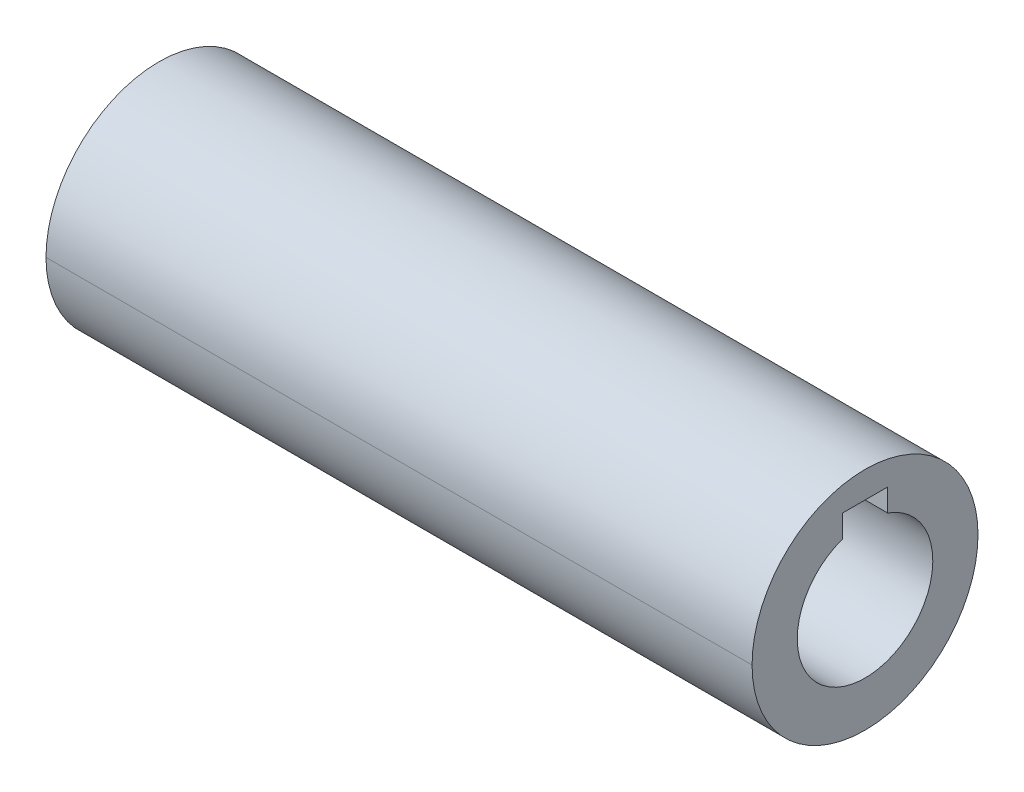
ISO-10303-21;
HEADER;
FILE_DESCRIPTION(('STEP AP214'),'2;1');
FILE_NAME('part.step','',(''),(''),'','','');
FILE_SCHEMA(('AUTOMOTIVE_DESIGN { 1 0 10303 214 1 1 1 1 }'));
ENDSEC;
DATA;
#1=APPLICATION_CONTEXT('core data for automotive mechanical design processes');
#2=APPLICATION_PROTOCOL_DEFINITION('international standard','automotive_design',2000,#1);
#3=PRODUCT_CONTEXT('',#1,'mechanical');
#4=PRODUCT('Part','Part','',(#3));
#5=PRODUCT_RELATED_PRODUCT_CATEGORY('part','',(#4));
#6=PRODUCT_DEFINITION_FORMATION('','',#4);
#7=PRODUCT_DEFINITION_CONTEXT('part definition',#1,'design');
#8=PRODUCT_DEFINITION('design','',#6,#7);
#9=PRODUCT_DEFINITION_SHAPE('','',#8);
#10=(LENGTH_UNIT() NAMED_UNIT(*) SI_UNIT(.MILLI.,.METRE.));
#11=(NAMED_UNIT(*) PLANE_ANGLE_UNIT() SI_UNIT($,.RADIAN.));
#12=(NAMED_UNIT(*) SI_UNIT($,.STERADIAN.) SOLID_ANGLE_UNIT());
#13=UNCERTAINTY_MEASURE_WITH_UNIT(LENGTH_MEASURE(1.E-05),#10,'distance_accuracy_value','');
#14=(GEOMETRIC_REPRESENTATION_CONTEXT(3) GLOBAL_UNCERTAINTY_ASSIGNED_CONTEXT((#13)) GLOBAL_UNIT_ASSIGNED_CONTEXT((#10,
#11,#12)) REPRESENTATION_CONTEXT('',''));
#15=CARTESIAN_POINT('',(0.,0.,0.));
#16=DIRECTION('',(0.,0.,1.));
#17=DIRECTION('',(1.,0.,0.));
#18=AXIS2_PLACEMENT_3D('',#15,#16,#17);
#19=CARTESIAN_POINT('',(125.,0.,0.));
#20=DIRECTION('',(-1.,0.,0.));
#21=DIRECTION('',(0.,-1.,0.));
#22=AXIS2_PLACEMENT_3D('',#19,#20,#21);
#23=CYLINDRICAL_SURFACE('',#22,20.);
#24=CARTESIAN_POINT('',(125.,0.,0.));
#25=DIRECTION('',(1.,0.,0.));
#26=DIRECTION('',(0.,0.,-1.));
#27=AXIS2_PLACEMENT_3D('',#24,#25,#26);
#28=CIRCLE('',#27,20.);
#29=CARTESIAN_POINT('',(125.,0.,-20.));
#30=VERTEX_POINT('',#29);
#31=CARTESIAN_POINT('',(125.,0.,20.));
#32=VERTEX_POINT('',#31);
#33=EDGE_CURVE('E11',#30,#32,#28,.T.);
#34=ORIENTED_EDGE('',*,*,#33,.F.);
#35=DIRECTION('',(-1.,0.,0.));
#36=VECTOR('',#35,1.);
#37=CARTESIAN_POINT('',(125.,0.,-20.));
#38=LINE('',#37,#36);
#39=CARTESIAN_POINT('',(0.,0.,-20.));
#40=VERTEX_POINT('',#39);
#41=EDGE_CURVE('E25',#30,#40,#38,.T.);
#42=ORIENTED_EDGE('',*,*,#41,.T.);
#43=CARTESIAN_POINT('',(0.,0.,0.));
#44=DIRECTION('',(1.,0.,0.));
#45=DIRECTION('',(0.,0.,-1.));
#46=AXIS2_PLACEMENT_3D('',#43,#44,#45);
#47=CIRCLE('',#46,20.);
#48=CARTESIAN_POINT('',(0.,0.,20.));
#49=VERTEX_POINT('',#48);
#50=EDGE_CURVE('E187',#40,#49,#47,.T.);
#51=ORIENTED_EDGE('',*,*,#50,.T.);
#52=DIRECTION('',(-1.,0.,0.));
#53=VECTOR('',#52,1.);
#54=CARTESIAN_POINT('',(125.,0.,20.));
#55=LINE('',#54,#53);
#56=EDGE_CURVE('E182',#32,#49,#55,.T.);
#57=ORIENTED_EDGE('',*,*,#56,.F.);
#58=EDGE_LOOP('',(#34,#42,#51,#57));
#59=FACE_BOUND('',#58,.T.);
#60=ADVANCED_FACE('F17',(#59),#23,.T.);
#61=CARTESIAN_POINT('',(125.,0.,0.));
#62=DIRECTION('',(-1.,0.,0.));
#63=DIRECTION('',(0.,1.,0.));
#64=AXIS2_PLACEMENT_3D('',#61,#62,#63);
#65=CYLINDRICAL_SURFACE('',#64,20.);
#66=CARTESIAN_POINT('',(0.,0.,0.));
#67=DIRECTION('',(1.,0.,0.));
#68=DIRECTION('',(0.,0.,-1.));
#69=AXIS2_PLACEMENT_3D('',#66,#67,#68);
#70=CIRCLE('',#69,20.);
#71=EDGE_CURVE('E178',#49,#40,#70,.T.);
#72=ORIENTED_EDGE('',*,*,#71,.T.);
#73=ORIENTED_EDGE('',*,*,#41,.F.);
#74=CARTESIAN_POINT('',(125.,0.,0.));
#75=DIRECTION('',(1.,0.,0.));
#76=DIRECTION('',(0.,0.,-1.));
#77=AXIS2_PLACEMENT_3D('',#74,#75,#76);
#78=CIRCLE('',#77,20.);
#79=EDGE_CURVE('E173',#32,#30,#78,.T.);
#80=ORIENTED_EDGE('',*,*,#79,.F.);
#81=ORIENTED_EDGE('',*,*,#56,.T.);
#82=EDGE_LOOP('',(#72,#73,#80,#81));
#83=FACE_BOUND('',#82,.T.);
#84=ADVANCED_FACE('F200',(#83),#65,.T.);
#85=CARTESIAN_POINT('',(125.,20.,0.));
#86=DIRECTION('',(-1.,0.,0.));
#87=DIRECTION('',(0.,0.,1.));
#88=AXIS2_PLACEMENT_3D('',#85,#86,#87);
#89=PLANE('',#88);
#90=DIRECTION('',(0.,0.,1.));
#91=VECTOR('',#90,1.);
#92=CARTESIAN_POINT('',(125.,15.3,-4.));
#93=LINE('',#92,#91);
#94=CARTESIAN_POINT('',(125.,15.3,-4.));
#95=VERTEX_POINT('',#94);
#96=CARTESIAN_POINT('',(125.,15.3,4.));
#97=VERTEX_POINT('',#96);
#98=EDGE_CURVE('E168',#95,#97,#93,.T.);
#99=ORIENTED_EDGE('',*,*,#98,.F.);
#100=DIRECTION('',(0.,1.,0.));
#101=VECTOR('',#100,1.);
#102=CARTESIAN_POINT('',(125.,3.3,-4.));
#103=LINE('',#102,#101);
#104=CARTESIAN_POINT('',(125.,11.3137084989848,-4.));
#105=VERTEX_POINT('',#104);
#106=EDGE_CURVE('E164',#105,#95,#103,.T.);
#107=ORIENTED_EDGE('',*,*,#106,.F.);
#108=CARTESIAN_POINT('',(125.,0.,0.));
#109=DIRECTION('',(1.,0.,0.));
#110=DIRECTION('',(0.,0.,-1.));
#111=AXIS2_PLACEMENT_3D('',#108,#109,#110);
#112=CIRCLE('',#111,12.);
#113=CARTESIAN_POINT('',(125.,11.3137084989848,4.));
#114=VERTEX_POINT('',#113);
#115=EDGE_CURVE('E159',#114,#105,#112,.T.);
#116=ORIENTED_EDGE('',*,*,#115,.F.);
#117=DIRECTION('',(0.,-1.,0.));
#118=VECTOR('',#117,1.);
#119=CARTESIAN_POINT('',(125.,15.3,4.));
#120=LINE('',#119,#118);
#121=EDGE_CURVE('E154',#97,#114,#120,.T.);
#122=ORIENTED_EDGE('',*,*,#121,.F.);
#123=EDGE_LOOP('',(#99,#107,#116,#122));
#124=FACE_BOUND('',#123,.T.);
#125=ORIENTED_EDGE('',*,*,#33,.T.);
#126=ORIENTED_EDGE('',*,*,#79,.T.);
#127=EDGE_LOOP('',(#125,#126));
#128=FACE_BOUND('',#127,.T.);
#129=ADVANCED_FACE('F215',(#124,#128),#89,.F.);
#130=CARTESIAN_POINT('',(75.,15.3,4.));
#131=DIRECTION('',(0.,0.,1.));
#132=DIRECTION('',(1.,0.,0.));
#133=AXIS2_PLACEMENT_3D('',#130,#131,#132);
#134=PLANE('',#133);
#135=DIRECTION('',(0.,-1.,0.));
#136=VECTOR('',#135,1.);
#137=CARTESIAN_POINT('',(105.,12.,4.));
#138=LINE('',#137,#136);
#139=CARTESIAN_POINT('',(105.,11.842719282327,4.));
#140=VERTEX_POINT('',#139);
#141=CARTESIAN_POINT('',(105.,11.3137084989848,4.));
#142=VERTEX_POINT('',#141);
#143=EDGE_CURVE('E149',#140,#142,#138,.T.);
#144=ORIENTED_EDGE('',*,*,#143,.F.);
#145=DIRECTION('',(1.,0.,0.));
#146=VECTOR('',#145,1.);
#147=CARTESIAN_POINT('',(125.,11.842719282327,4.));
#148=LINE('',#147,#146);
#149=CARTESIAN_POINT('',(75.,11.842719282327,4.));
#150=VERTEX_POINT('',#149);
#151=EDGE_CURVE('E145',#150,#140,#148,.T.);
#152=ORIENTED_EDGE('',*,*,#151,.F.);
#153=DIRECTION('',(0.,-1.,0.));
#154=VECTOR('',#153,1.);
#155=CARTESIAN_POINT('',(75.,15.3,4.));
#156=LINE('',#155,#154);
#157=CARTESIAN_POINT('',(75.,15.3,4.));
#158=VERTEX_POINT('',#157);
#159=EDGE_CURVE('E101',#158,#150,#156,.T.);
#160=ORIENTED_EDGE('',*,*,#159,.F.);
#161=DIRECTION('',(1.,0.,0.));
#162=VECTOR('',#161,1.);
#163=CARTESIAN_POINT('',(75.,15.3,4.));
#164=LINE('',#163,#162);
#165=EDGE_CURVE('E137',#158,#97,#164,.T.);
#166=ORIENTED_EDGE('',*,*,#165,.T.);
#167=ORIENTED_EDGE('',*,*,#121,.T.);
#168=DIRECTION('',(1.,0.,0.));
#169=VECTOR('',#168,1.);
#170=CARTESIAN_POINT('',(125.,11.3137084989848,4.));
#171=LINE('',#170,#169);
#172=EDGE_CURVE('E132',#142,#114,#171,.T.);
#173=ORIENTED_EDGE('',*,*,#172,.F.);
#174=EDGE_LOOP('',(#144,#152,#160,#166,#167,#173));
#175=FACE_BOUND('',#174,.T.);
#176=ADVANCED_FACE('F219',(#175),#134,.F.);
#177=CARTESIAN_POINT('',(125.,0.,0.));
#178=DIRECTION('',(-1.,0.,0.));
#179=DIRECTION('',(0.,1.,0.));
#180=AXIS2_PLACEMENT_3D('',#177,#178,#179);
#181=CYLINDRICAL_SURFACE('',#180,12.);
#182=DIRECTION('',(1.,0.,0.));
#183=VECTOR('',#182,1.);
#184=CARTESIAN_POINT('',(125.,11.3137084989848,-4.));
#185=LINE('',#184,#183);
#186=CARTESIAN_POINT('',(105.,11.3137084989848,-4.));
#187=VERTEX_POINT('',#186);
#188=EDGE_CURVE('E127',#187,#105,#185,.T.);
#189=ORIENTED_EDGE('',*,*,#188,.F.);
#190=CARTESIAN_POINT('',(105.,0.,0.));
#191=DIRECTION('',(1.,0.,0.));
#192=DIRECTION('',(0.,0.,-1.));
#193=AXIS2_PLACEMENT_3D('',#190,#191,#192);
#194=CIRCLE('',#193,12.);
#195=EDGE_CURVE('E122',#142,#187,#194,.T.);
#196=ORIENTED_EDGE('',*,*,#195,.F.);
#197=ORIENTED_EDGE('',*,*,#172,.T.);
#198=ORIENTED_EDGE('',*,*,#115,.T.);
#199=EDGE_LOOP('',(#189,#196,#197,#198));
#200=FACE_BOUND('',#199,.T.);
#201=ADVANCED_FACE('F225',(#200),#181,.F.);
#202=CARTESIAN_POINT('',(105.,12.,0.));
#203=DIRECTION('',(1.,0.,0.));
#204=DIRECTION('',(0.,0.,-1.));
#205=AXIS2_PLACEMENT_3D('',#202,#203,#204);
#206=PLANE('',#205);
#207=CARTESIAN_POINT('',(105.,0.,0.));
#208=DIRECTION('',(1.,0.,0.));
#209=DIRECTION('',(0.,0.,-1.));
#210=AXIS2_PLACEMENT_3D('',#207,#208,#209);
#211=CIRCLE('',#210,12.5);
#212=CARTESIAN_POINT('',(105.,11.842719282327,-4.));
#213=VERTEX_POINT('',#212);
#214=EDGE_CURVE('E98',#140,#213,#211,.T.);
#215=ORIENTED_EDGE('',*,*,#214,.F.);
#216=ORIENTED_EDGE('',*,*,#143,.T.);
#217=ORIENTED_EDGE('',*,*,#195,.T.);
#218=DIRECTION('',(0.,1.,0.));
#219=VECTOR('',#218,1.);
#220=CARTESIAN_POINT('',(105.,12.,-4.));
#221=LINE('',#220,#219);
#222=EDGE_CURVE('E115',#187,#213,#221,.T.);
#223=ORIENTED_EDGE('',*,*,#222,.T.);
#224=EDGE_LOOP('',(#215,#216,#217,#223));
#225=FACE_BOUND('',#224,.T.);
#226=ADVANCED_FACE('F229',(#225),#206,.F.);
#227=CARTESIAN_POINT('',(75.,3.3,-4.));
#228=DIRECTION('',(0.,0.,-1.));
#229=DIRECTION('',(-1.,0.,0.));
#230=AXIS2_PLACEMENT_3D('',#227,#228,#229);
#231=PLANE('',#230);
#232=ORIENTED_EDGE('',*,*,#106,.T.);
#233=DIRECTION('',(1.,0.,0.));
#234=VECTOR('',#233,1.);
#235=CARTESIAN_POINT('',(75.,15.3,-4.));
#236=LINE('',#235,#234);
#237=CARTESIAN_POINT('',(75.,15.3,-4.));
#238=VERTEX_POINT('',#237);
#239=EDGE_CURVE('E85',#238,#95,#236,.T.);
#240=ORIENTED_EDGE('',*,*,#239,.F.);
#241=DIRECTION('',(0.,1.,0.));
#242=VECTOR('',#241,1.);
#243=CARTESIAN_POINT('',(75.,3.3,-4.));
#244=LINE('',#243,#242);
#245=CARTESIAN_POINT('',(75.,11.842719282327,-4.));
#246=VERTEX_POINT('',#245);
#247=EDGE_CURVE('E77',#246,#238,#244,.T.);
#248=ORIENTED_EDGE('',*,*,#247,.F.);
#249=DIRECTION('',(1.,0.,0.));
#250=VECTOR('',#249,1.);
#251=CARTESIAN_POINT('',(125.,11.842719282327,-4.));
#252=LINE('',#251,#250);
#253=EDGE_CURVE('E82',#246,#213,#252,.T.);
#254=ORIENTED_EDGE('',*,*,#253,.T.);
#255=ORIENTED_EDGE('',*,*,#222,.F.);
#256=ORIENTED_EDGE('',*,*,#188,.T.);
#257=EDGE_LOOP('',(#232,#240,#248,#254,#255,#256));
#258=FACE_BOUND('',#257,.T.);
#259=ADVANCED_FACE('F80',(#258),#231,.F.);
#260=CARTESIAN_POINT('',(125.,0.,0.));
#261=DIRECTION('',(-1.,0.,0.));
#262=DIRECTION('',(0.,1.,0.));
#263=AXIS2_PLACEMENT_3D('',#260,#261,#262);
#264=CYLINDRICAL_SURFACE('',#263,12.5);
#265=ORIENTED_EDGE('',*,*,#253,.F.);
#266=CARTESIAN_POINT('',(75.,0.,0.));
#267=DIRECTION('',(1.,0.,0.));
#268=DIRECTION('',(0.,0.,-1.));
#269=AXIS2_PLACEMENT_3D('',#266,#267,#268);
#270=CIRCLE('',#269,12.5);
#271=EDGE_CURVE('E95',#150,#246,#270,.T.);
#272=ORIENTED_EDGE('',*,*,#271,.F.);
#273=ORIENTED_EDGE('',*,*,#151,.T.);
#274=ORIENTED_EDGE('',*,*,#214,.T.);
#275=EDGE_LOOP('',(#265,#272,#273,#274));
#276=FACE_BOUND('',#275,.T.);
#277=ADVANCED_FACE('F93',(#276),#264,.F.);
#278=CARTESIAN_POINT('',(75.,12.5,0.));
#279=DIRECTION('',(-1.,0.,0.));
#280=DIRECTION('',(0.,0.,1.));
#281=AXIS2_PLACEMENT_3D('',#278,#279,#280);
#282=PLANE('',#281);
#283=ORIENTED_EDGE('',*,*,#159,.T.);
#284=ORIENTED_EDGE('',*,*,#271,.T.);
#285=ORIENTED_EDGE('',*,*,#247,.T.);
#286=DIRECTION('',(0.,0.,1.));
#287=VECTOR('',#286,1.);
#288=CARTESIAN_POINT('',(75.,15.3,-4.));
#289=LINE('',#288,#287);
#290=EDGE_CURVE('E102',#238,#158,#289,.T.);
#291=ORIENTED_EDGE('',*,*,#290,.T.);
#292=EDGE_LOOP('',(#283,#284,#285,#291));
#293=FACE_BOUND('',#292,.T.);
#294=ADVANCED_FACE('F100',(#293),#282,.F.);
#295=CARTESIAN_POINT('',(75.,15.3,-4.));
#296=DIRECTION('',(0.,1.,0.));
#297=DIRECTION('',(0.,0.,1.));
#298=AXIS2_PLACEMENT_3D('',#295,#296,#297);
#299=PLANE('',#298);
#300=ORIENTED_EDGE('',*,*,#239,.T.);
#301=ORIENTED_EDGE('',*,*,#98,.T.);
#302=ORIENTED_EDGE('',*,*,#165,.F.);
#303=ORIENTED_EDGE('',*,*,#290,.F.);
#304=EDGE_LOOP('',(#300,#301,#302,#303));
#305=FACE_BOUND('',#304,.T.);
#306=ADVANCED_FACE('F203',(#305),#299,.F.);
#307=CARTESIAN_POINT('',(0.,0.,0.));
#308=DIRECTION('',(1.,0.,0.));
#309=DIRECTION('',(0.,0.,-1.));
#310=AXIS2_PLACEMENT_3D('',#307,#308,#309);
#311=PLANE('',#310);
#312=ORIENTED_EDGE('',*,*,#50,.F.);
#313=ORIENTED_EDGE('',*,*,#71,.F.);
#314=EDGE_LOOP('',(#312,#313));
#315=FACE_BOUND('',#314,.T.);
#316=ADVANCED_FACE('F201',(#315),#311,.F.);
#317=CLOSED_SHELL('',(#60,#84,#129,#176,#201,#226,#259,#277,#294,#306,#316));
#318=MANIFOLD_SOLID_BREP('B1',#317);
#319=ADVANCED_BREP_SHAPE_REPRESENTATION('',(#18,#318),#14);
#320=SHAPE_DEFINITION_REPRESENTATION(#9,#319);
ENDSEC;
END-ISO-10303-21;
